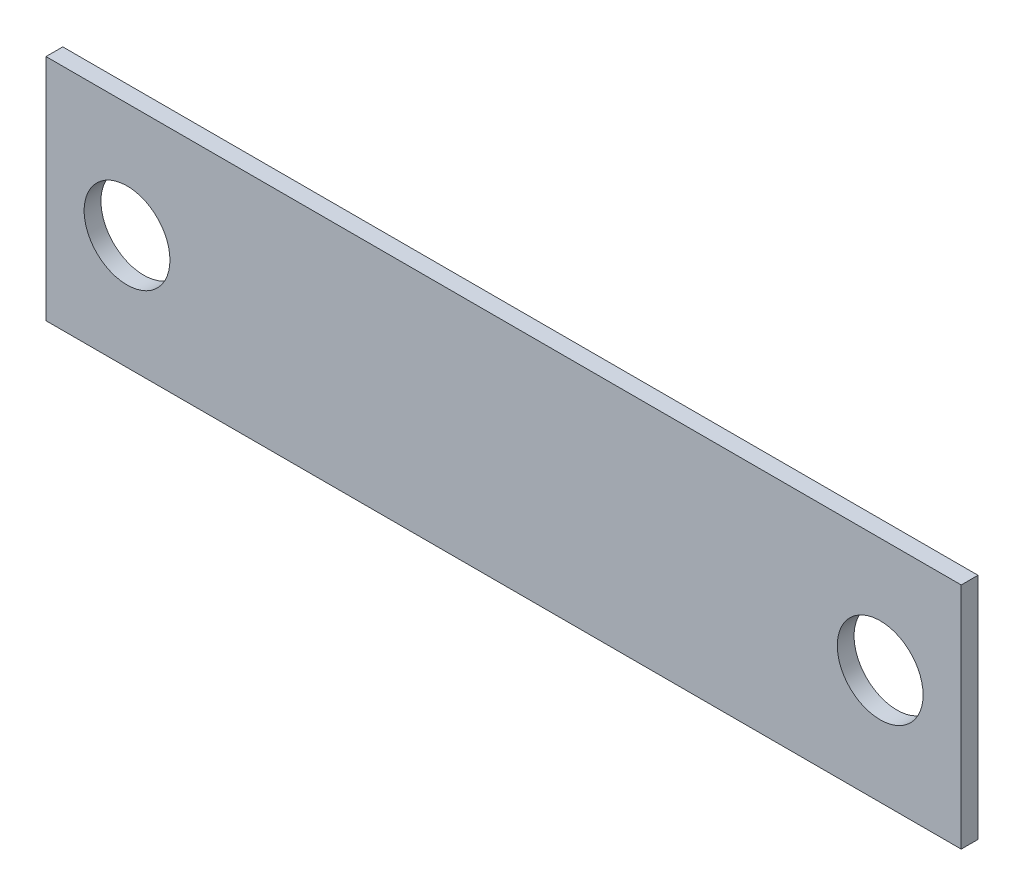
ISO-10303-21;
HEADER;
FILE_DESCRIPTION(('STEP AP214'),'2;1');
FILE_NAME('part.step','',(''),(''),'','','');
FILE_SCHEMA(('AUTOMOTIVE_DESIGN { 1 0 10303 214 1 1 1 1 }'));
ENDSEC;
DATA;
#1=APPLICATION_CONTEXT('core data for automotive mechanical design processes');
#2=APPLICATION_PROTOCOL_DEFINITION('international standard','automotive_design',2000,#1);
#3=PRODUCT_CONTEXT('',#1,'mechanical');
#4=PRODUCT('Part','Part','',(#3));
#5=PRODUCT_RELATED_PRODUCT_CATEGORY('part','',(#4));
#6=PRODUCT_DEFINITION_FORMATION('','',#4);
#7=PRODUCT_DEFINITION_CONTEXT('part definition',#1,'design');
#8=PRODUCT_DEFINITION('design','',#6,#7);
#9=PRODUCT_DEFINITION_SHAPE('','',#8);
#10=(LENGTH_UNIT() NAMED_UNIT(*) SI_UNIT(.MILLI.,.METRE.));
#11=(NAMED_UNIT(*) PLANE_ANGLE_UNIT() SI_UNIT($,.RADIAN.));
#12=(NAMED_UNIT(*) SI_UNIT($,.STERADIAN.) SOLID_ANGLE_UNIT());
#13=UNCERTAINTY_MEASURE_WITH_UNIT(LENGTH_MEASURE(1.E-05),#10,'distance_accuracy_value','');
#14=(GEOMETRIC_REPRESENTATION_CONTEXT(3) GLOBAL_UNCERTAINTY_ASSIGNED_CONTEXT((#13)) GLOBAL_UNIT_ASSIGNED_CONTEXT((#10,
#11,#12)) REPRESENTATION_CONTEXT('',''));
#15=CARTESIAN_POINT('',(0.,0.,0.));
#16=DIRECTION('',(0.,0.,1.));
#17=DIRECTION('',(1.,0.,0.));
#18=AXIS2_PLACEMENT_3D('',#15,#16,#17);
#19=CARTESIAN_POINT('',(152.4,-38.1,5.588));
#20=DIRECTION('',(-1.,0.,0.));
#21=DIRECTION('',(0.,0.,1.));
#22=AXIS2_PLACEMENT_3D('',#19,#20,#21);
#23=PLANE('',#22);
#24=DIRECTION('',(0.,1.,0.));
#25=VECTOR('',#24,1.);
#26=CARTESIAN_POINT('',(152.4,-38.1,0.));
#27=LINE('',#26,#25);
#28=CARTESIAN_POINT('',(152.4,-38.1,0.));
#29=VERTEX_POINT('',#28);
#30=CARTESIAN_POINT('',(152.4,38.1,0.));
#31=VERTEX_POINT('',#30);
#32=EDGE_CURVE('E96',#29,#31,#27,.T.);
#33=ORIENTED_EDGE('',*,*,#32,.T.);
#34=DIRECTION('',(0.,0.,-1.));
#35=VECTOR('',#34,1.);
#36=CARTESIAN_POINT('',(152.4,38.1,5.588));
#37=LINE('',#36,#35);
#38=CARTESIAN_POINT('',(152.4,38.1,5.588));
#39=VERTEX_POINT('',#38);
#40=EDGE_CURVE('E11',#39,#31,#37,.T.);
#41=ORIENTED_EDGE('',*,*,#40,.F.);
#42=DIRECTION('',(0.,1.,0.));
#43=VECTOR('',#42,1.);
#44=CARTESIAN_POINT('',(152.4,-38.1,5.588));
#45=LINE('',#44,#43);
#46=CARTESIAN_POINT('',(152.4,-38.1,5.588));
#47=VERTEX_POINT('',#46);
#48=EDGE_CURVE('E84',#47,#39,#45,.T.);
#49=ORIENTED_EDGE('',*,*,#48,.F.);
#50=DIRECTION('',(0.,0.,-1.));
#51=VECTOR('',#50,1.);
#52=CARTESIAN_POINT('',(152.4,-38.1,5.588));
#53=LINE('',#52,#51);
#54=EDGE_CURVE('E92',#47,#29,#53,.T.);
#55=ORIENTED_EDGE('',*,*,#54,.T.);
#56=EDGE_LOOP('',(#33,#41,#49,#55));
#57=FACE_BOUND('',#56,.T.);
#58=ADVANCED_FACE('F33',(#57),#23,.F.);
#59=CARTESIAN_POINT('',(-152.4,38.1,5.588));
#60=DIRECTION('',(0.,-1.,0.));
#61=DIRECTION('',(0.,0.,-1.));
#62=AXIS2_PLACEMENT_3D('',#59,#60,#61);
#63=PLANE('',#62);
#64=DIRECTION('',(-1.,0.,0.));
#65=VECTOR('',#64,1.);
#66=CARTESIAN_POINT('',(-152.4,38.1,0.));
#67=LINE('',#66,#65);
#68=CARTESIAN_POINT('',(-152.4,38.1,0.));
#69=VERTEX_POINT('',#68);
#70=EDGE_CURVE('E88',#31,#69,#67,.T.);
#71=ORIENTED_EDGE('',*,*,#70,.T.);
#72=DIRECTION('',(0.,0.,-1.));
#73=VECTOR('',#72,1.);
#74=CARTESIAN_POINT('',(-152.4,38.1,5.588));
#75=LINE('',#74,#73);
#76=CARTESIAN_POINT('',(-152.4,38.1,5.588));
#77=VERTEX_POINT('',#76);
#78=EDGE_CURVE('E41',#77,#69,#75,.T.);
#79=ORIENTED_EDGE('',*,*,#78,.F.);
#80=DIRECTION('',(-1.,0.,0.));
#81=VECTOR('',#80,1.);
#82=CARTESIAN_POINT('',(-152.4,38.1,5.588));
#83=LINE('',#82,#81);
#84=EDGE_CURVE('E79',#39,#77,#83,.T.);
#85=ORIENTED_EDGE('',*,*,#84,.F.);
#86=ORIENTED_EDGE('',*,*,#40,.T.);
#87=EDGE_LOOP('',(#71,#79,#85,#86));
#88=FACE_BOUND('',#87,.T.);
#89=ADVANCED_FACE('F87',(#88),#63,.F.);
#90=CARTESIAN_POINT('',(-152.4,-38.1,5.588));
#91=DIRECTION('',(1.,0.,0.));
#92=DIRECTION('',(0.,0.,-1.));
#93=AXIS2_PLACEMENT_3D('',#90,#91,#92);
#94=PLANE('',#93);
#95=DIRECTION('',(0.,-1.,0.));
#96=VECTOR('',#95,1.);
#97=CARTESIAN_POINT('',(-152.4,-38.1,0.));
#98=LINE('',#97,#96);
#99=CARTESIAN_POINT('',(-152.4,-38.1,0.));
#100=VERTEX_POINT('',#99);
#101=EDGE_CURVE('E66',#69,#100,#98,.T.);
#102=ORIENTED_EDGE('',*,*,#101,.T.);
#103=DIRECTION('',(0.,0.,-1.));
#104=VECTOR('',#103,1.);
#105=CARTESIAN_POINT('',(-152.4,-38.1,5.588));
#106=LINE('',#105,#104);
#107=CARTESIAN_POINT('',(-152.4,-38.1,5.588));
#108=VERTEX_POINT('',#107);
#109=EDGE_CURVE('E89',#108,#100,#106,.T.);
#110=ORIENTED_EDGE('',*,*,#109,.F.);
#111=DIRECTION('',(0.,-1.,0.));
#112=VECTOR('',#111,1.);
#113=CARTESIAN_POINT('',(-152.4,-38.1,5.588));
#114=LINE('',#113,#112);
#115=EDGE_CURVE('E82',#77,#108,#114,.T.);
#116=ORIENTED_EDGE('',*,*,#115,.F.);
#117=ORIENTED_EDGE('',*,*,#78,.T.);
#118=EDGE_LOOP('',(#102,#110,#116,#117));
#119=FACE_BOUND('',#118,.T.);
#120=ADVANCED_FACE('F90',(#119),#94,.F.);
#121=CARTESIAN_POINT('',(-152.4,-38.1,5.588));
#122=DIRECTION('',(0.,1.,0.));
#123=DIRECTION('',(0.,0.,1.));
#124=AXIS2_PLACEMENT_3D('',#121,#122,#123);
#125=PLANE('',#124);
#126=DIRECTION('',(1.,0.,0.));
#127=VECTOR('',#126,1.);
#128=CARTESIAN_POINT('',(-152.4,-38.1,0.));
#129=LINE('',#128,#127);
#130=EDGE_CURVE('E72',#100,#29,#129,.T.);
#131=ORIENTED_EDGE('',*,*,#130,.T.);
#132=ORIENTED_EDGE('',*,*,#54,.F.);
#133=DIRECTION('',(1.,0.,0.));
#134=VECTOR('',#133,1.);
#135=CARTESIAN_POINT('',(-152.4,-38.1,5.588));
#136=LINE('',#135,#134);
#137=EDGE_CURVE('E49',#108,#47,#136,.T.);
#138=ORIENTED_EDGE('',*,*,#137,.F.);
#139=ORIENTED_EDGE('',*,*,#109,.T.);
#140=EDGE_LOOP('',(#131,#132,#138,#139));
#141=FACE_BOUND('',#140,.T.);
#142=ADVANCED_FACE('F104',(#141),#125,.F.);
#143=CARTESIAN_POINT('',(0.,0.,5.588));
#144=DIRECTION('',(0.,0.,-1.));
#145=DIRECTION('',(-1.,0.,0.));
#146=AXIS2_PLACEMENT_3D('',#143,#144,#145);
#147=PLANE('',#146);
#148=CARTESIAN_POINT('',(125.4125,0.,5.588));
#149=DIRECTION('',(0.,0.,1.));
#150=DIRECTION('',(1.,0.,0.));
#151=AXIS2_PLACEMENT_3D('',#148,#149,#150);
#152=CIRCLE('',#151,14.2875);
#153=CARTESIAN_POINT('',(139.7,0.,5.588));
#154=VERTEX_POINT('',#153);
#155=EDGE_CURVE('E116',#154,#154,#152,.T.);
#156=ORIENTED_EDGE('',*,*,#155,.F.);
#157=EDGE_LOOP('',(#156));
#158=FACE_BOUND('',#157,.T.);
#159=CARTESIAN_POINT('',(-125.4125,0.,5.588));
#160=DIRECTION('',(0.,0.,1.));
#161=DIRECTION('',(1.,0.,0.));
#162=AXIS2_PLACEMENT_3D('',#159,#160,#161);
#163=CIRCLE('',#162,14.2875);
#164=CARTESIAN_POINT('',(-111.125,0.,5.588));
#165=VERTEX_POINT('',#164);
#166=EDGE_CURVE('E110',#165,#165,#163,.T.);
#167=ORIENTED_EDGE('',*,*,#166,.F.);
#168=EDGE_LOOP('',(#167));
#169=FACE_BOUND('',#168,.T.);
#170=ORIENTED_EDGE('',*,*,#48,.T.);
#171=ORIENTED_EDGE('',*,*,#84,.T.);
#172=ORIENTED_EDGE('',*,*,#115,.T.);
#173=ORIENTED_EDGE('',*,*,#137,.T.);
#174=EDGE_LOOP('',(#170,#171,#172,#173));
#175=FACE_BOUND('',#174,.T.);
#176=ADVANCED_FACE('F80',(#158,#169,#175),#147,.F.);
#177=CARTESIAN_POINT('',(0.,0.,0.));
#178=DIRECTION('',(0.,0.,-1.));
#179=DIRECTION('',(-1.,0.,0.));
#180=AXIS2_PLACEMENT_3D('',#177,#178,#179);
#181=PLANE('',#180);
#182=CARTESIAN_POINT('',(125.4125,0.,0.));
#183=DIRECTION('',(0.,0.,1.));
#184=DIRECTION('',(1.,0.,0.));
#185=AXIS2_PLACEMENT_3D('',#182,#183,#184);
#186=CIRCLE('',#185,14.2875);
#187=CARTESIAN_POINT('',(139.7,0.,0.));
#188=VERTEX_POINT('',#187);
#189=EDGE_CURVE('E113',#188,#188,#186,.T.);
#190=ORIENTED_EDGE('',*,*,#189,.T.);
#191=EDGE_LOOP('',(#190));
#192=FACE_BOUND('',#191,.T.);
#193=CARTESIAN_POINT('',(-125.4125,0.,0.));
#194=DIRECTION('',(0.,0.,1.));
#195=DIRECTION('',(1.,0.,0.));
#196=AXIS2_PLACEMENT_3D('',#193,#194,#195);
#197=CIRCLE('',#196,14.2875);
#198=CARTESIAN_POINT('',(-111.125,0.,0.));
#199=VERTEX_POINT('',#198);
#200=EDGE_CURVE('E99',#199,#199,#197,.T.);
#201=ORIENTED_EDGE('',*,*,#200,.T.);
#202=EDGE_LOOP('',(#201));
#203=FACE_BOUND('',#202,.T.);
#204=ORIENTED_EDGE('',*,*,#32,.F.);
#205=ORIENTED_EDGE('',*,*,#130,.F.);
#206=ORIENTED_EDGE('',*,*,#101,.F.);
#207=ORIENTED_EDGE('',*,*,#70,.F.);
#208=EDGE_LOOP('',(#204,#205,#206,#207));
#209=FACE_BOUND('',#208,.T.);
#210=ADVANCED_FACE('F107',(#192,#203,#209),#181,.T.);
#211=CARTESIAN_POINT('',(-125.4125,0.,0.));
#212=DIRECTION('',(0.,0.,1.));
#213=DIRECTION('',(1.,0.,0.));
#214=AXIS2_PLACEMENT_3D('',#211,#212,#213);
#215=CYLINDRICAL_SURFACE('',#214,14.2875);
#216=ORIENTED_EDGE('',*,*,#200,.F.);
#217=EDGE_LOOP('',(#216));
#218=FACE_BOUND('',#217,.T.);
#219=ORIENTED_EDGE('',*,*,#166,.T.);
#220=EDGE_LOOP('',(#219));
#221=FACE_BOUND('',#220,.T.);
#222=ADVANCED_FACE('F127',(#218,#221),#215,.F.);
#223=CARTESIAN_POINT('',(125.4125,0.,0.));
#224=DIRECTION('',(0.,0.,1.));
#225=DIRECTION('',(1.,0.,0.));
#226=AXIS2_PLACEMENT_3D('',#223,#224,#225);
#227=CYLINDRICAL_SURFACE('',#226,14.2875);
#228=ORIENTED_EDGE('',*,*,#189,.F.);
#229=EDGE_LOOP('',(#228));
#230=FACE_BOUND('',#229,.T.);
#231=ORIENTED_EDGE('',*,*,#155,.T.);
#232=EDGE_LOOP('',(#231));
#233=FACE_BOUND('',#232,.T.);
#234=ADVANCED_FACE('F124',(#230,#233),#227,.F.);
#235=CLOSED_SHELL('',(#58,#89,#120,#142,#176,#210,#222,#234));
#236=MANIFOLD_SOLID_BREP('B2',#235);
#237=ADVANCED_BREP_SHAPE_REPRESENTATION('',(#18,#236),#14);
#238=SHAPE_DEFINITION_REPRESENTATION(#9,#237);
ENDSEC;
END-ISO-10303-21;
